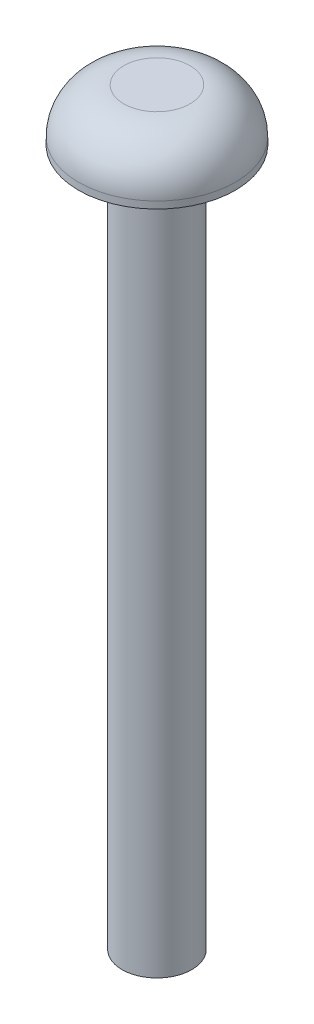
ISO-10303-21;
HEADER;
FILE_DESCRIPTION(('STEP AP214'),'2;1');
FILE_NAME('part.step','',(''),(''),'','','');
FILE_SCHEMA(('AUTOMOTIVE_DESIGN { 1 0 10303 214 1 1 1 1 }'));
ENDSEC;
DATA;
#1=APPLICATION_CONTEXT('core data for automotive mechanical design processes');
#2=APPLICATION_PROTOCOL_DEFINITION('international standard','automotive_design',2000,#1);
#3=PRODUCT_CONTEXT('',#1,'mechanical');
#4=PRODUCT('Part','Part','',(#3));
#5=PRODUCT_RELATED_PRODUCT_CATEGORY('part','',(#4));
#6=PRODUCT_DEFINITION_FORMATION('','',#4);
#7=PRODUCT_DEFINITION_CONTEXT('part definition',#1,'design');
#8=PRODUCT_DEFINITION('design','',#6,#7);
#9=PRODUCT_DEFINITION_SHAPE('','',#8);
#10=(LENGTH_UNIT() NAMED_UNIT(*) SI_UNIT(.MILLI.,.METRE.));
#11=(NAMED_UNIT(*) PLANE_ANGLE_UNIT() SI_UNIT($,.RADIAN.));
#12=(NAMED_UNIT(*) SI_UNIT($,.STERADIAN.) SOLID_ANGLE_UNIT());
#13=UNCERTAINTY_MEASURE_WITH_UNIT(LENGTH_MEASURE(1.E-05),#10,'distance_accuracy_value','');
#14=(GEOMETRIC_REPRESENTATION_CONTEXT(3) GLOBAL_UNCERTAINTY_ASSIGNED_CONTEXT((#13)) GLOBAL_UNIT_ASSIGNED_CONTEXT((#10,
#11,#12)) REPRESENTATION_CONTEXT('',''));
#15=CARTESIAN_POINT('',(0.,0.,0.));
#16=DIRECTION('',(0.,0.,1.));
#17=DIRECTION('',(1.,0.,0.));
#18=AXIS2_PLACEMENT_3D('',#15,#16,#17);
#19=CARTESIAN_POINT('',(0.,40.,0.));
#20=DIRECTION('',(0.,-1.,0.));
#21=DIRECTION('',(0.,0.,-1.));
#22=AXIS2_PLACEMENT_3D('',#19,#20,#21);
#23=CYLINDRICAL_SURFACE('',#22,2.);
#24=CARTESIAN_POINT('',(0.,40.,0.));
#25=DIRECTION('',(0.,1.,0.));
#26=DIRECTION('',(0.,0.,1.));
#27=AXIS2_PLACEMENT_3D('',#24,#25,#26);
#28=CIRCLE('',#27,2.);
#29=CARTESIAN_POINT('',(0.,40.,2.));
#30=VERTEX_POINT('',#29);
#31=EDGE_CURVE('E49',#30,#30,#28,.T.);
#32=ORIENTED_EDGE('',*,*,#31,.F.);
#33=EDGE_LOOP('',(#32));
#34=FACE_BOUND('',#33,.T.);
#35=CARTESIAN_POINT('',(0.,0.,0.));
#36=DIRECTION('',(0.,1.,0.));
#37=DIRECTION('',(0.,0.,1.));
#38=AXIS2_PLACEMENT_3D('',#35,#36,#37);
#39=CIRCLE('',#38,2.);
#40=CARTESIAN_POINT('',(0.,0.,2.));
#41=VERTEX_POINT('',#40);
#42=EDGE_CURVE('E54',#41,#41,#39,.T.);
#43=ORIENTED_EDGE('',*,*,#42,.T.);
#44=EDGE_LOOP('',(#43));
#45=FACE_BOUND('',#44,.T.);
#46=ADVANCED_FACE('F36',(#34,#45),#23,.T.);
#47=CARTESIAN_POINT('',(0.,0.,0.));
#48=DIRECTION('',(0.,1.,0.));
#49=DIRECTION('',(0.,0.,1.));
#50=AXIS2_PLACEMENT_3D('',#47,#48,#49);
#51=PLANE('',#50);
#52=ORIENTED_EDGE('',*,*,#42,.F.);
#53=EDGE_LOOP('',(#52));
#54=FACE_BOUND('',#53,.T.);
#55=ADVANCED_FACE('F81',(#54),#51,.F.);
#56=CARTESIAN_POINT('',(0.,43.,0.));
#57=DIRECTION('',(0.,-1.,0.));
#58=DIRECTION('',(0.,0.,-1.));
#59=AXIS2_PLACEMENT_3D('',#56,#57,#58);
#60=CYLINDRICAL_SURFACE('',#59,4.5);
#61=CARTESIAN_POINT('',(0.,40.4,0.));
#62=DIRECTION('',(0.,1.,0.));
#63=DIRECTION('',(0.,0.,1.));
#64=AXIS2_PLACEMENT_3D('',#61,#62,#63);
#65=CIRCLE('',#64,4.5);
#66=CARTESIAN_POINT('',(0.,40.4,4.5));
#67=VERTEX_POINT('',#66);
#68=EDGE_CURVE('E10',#67,#67,#65,.F.);
#69=ORIENTED_EDGE('',*,*,#68,.T.);
#70=EDGE_LOOP('',(#69));
#71=FACE_BOUND('',#70,.T.);
#72=CARTESIAN_POINT('',(0.,40.,0.));
#73=DIRECTION('',(0.,1.,0.));
#74=DIRECTION('',(0.,0.,1.));
#75=AXIS2_PLACEMENT_3D('',#72,#73,#74);
#76=CIRCLE('',#75,4.5);
#77=CARTESIAN_POINT('',(0.,40.,4.5));
#78=VERTEX_POINT('',#77);
#79=EDGE_CURVE('E59',#78,#78,#76,.T.);
#80=ORIENTED_EDGE('',*,*,#79,.T.);
#81=EDGE_LOOP('',(#80));
#82=FACE_BOUND('',#81,.T.);
#83=ADVANCED_FACE('F65',(#71,#82),#60,.T.);
#84=CARTESIAN_POINT('',(0.,43.,0.));
#85=DIRECTION('',(0.,1.,0.));
#86=DIRECTION('',(0.,0.,1.));
#87=AXIS2_PLACEMENT_3D('',#84,#85,#86);
#88=PLANE('',#87);
#89=CARTESIAN_POINT('',(0.,43.,0.));
#90=DIRECTION('',(0.,1.,0.));
#91=DIRECTION('',(0.,0.,1.));
#92=AXIS2_PLACEMENT_3D('',#89,#90,#91);
#93=CIRCLE('',#92,1.9);
#94=CARTESIAN_POINT('',(0.,43.,1.9));
#95=VERTEX_POINT('',#94);
#96=EDGE_CURVE('E44',#95,#95,#93,.T.);
#97=ORIENTED_EDGE('',*,*,#96,.T.);
#98=EDGE_LOOP('',(#97));
#99=FACE_BOUND('',#98,.T.);
#100=ADVANCED_FACE('F69',(#99),#88,.T.);
#101=CARTESIAN_POINT('',(0.,40.,0.));
#102=DIRECTION('',(0.,1.,0.));
#103=DIRECTION('',(0.,0.,1.));
#104=AXIS2_PLACEMENT_3D('',#101,#102,#103);
#105=PLANE('',#104);
#106=ORIENTED_EDGE('',*,*,#31,.T.);
#107=EDGE_LOOP('',(#106));
#108=FACE_BOUND('',#107,.T.);
#109=ORIENTED_EDGE('',*,*,#79,.F.);
#110=EDGE_LOOP('',(#109));
#111=FACE_BOUND('',#110,.T.);
#112=ADVANCED_FACE('F67',(#108,#111),#105,.F.);
#113=CARTESIAN_POINT('',(0.,40.4,0.));
#114=DIRECTION('',(0.,1.,0.));
#115=DIRECTION('',(0.,0.,1.));
#116=AXIS2_PLACEMENT_3D('',#113,#114,#115);
#117=DEGENERATE_TOROIDAL_SURFACE('',#116,1.9,2.6,.T.);
#118=ORIENTED_EDGE('',*,*,#68,.F.);
#119=EDGE_LOOP('',(#118));
#120=FACE_BOUND('',#119,.T.);
#121=ORIENTED_EDGE('',*,*,#96,.F.);
#122=EDGE_LOOP('',(#121));
#123=FACE_BOUND('',#122,.T.);
#124=ADVANCED_FACE('F38',(#120,#123),#117,.T.);
#125=CLOSED_SHELL('',(#46,#55,#83,#100,#112,#124));
#126=MANIFOLD_SOLID_BREP('B2',#125);
#127=ADVANCED_BREP_SHAPE_REPRESENTATION('',(#18,#126),#14);
#128=SHAPE_DEFINITION_REPRESENTATION(#9,#127);
ENDSEC;
END-ISO-10303-21;
